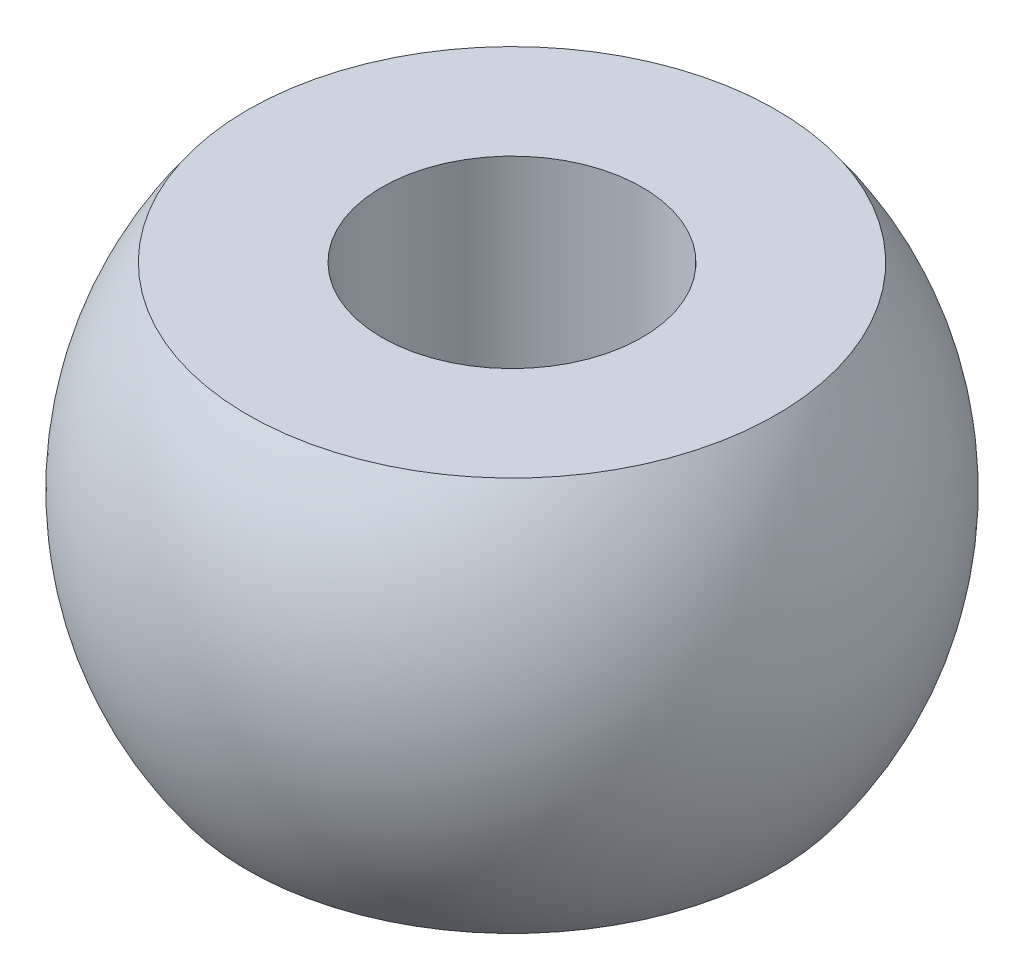
ISO-10303-21;
HEADER;
FILE_DESCRIPTION(('STEP AP214'),'2;1');
FILE_NAME('part.step','',(''),(''),'','','');
FILE_SCHEMA(('AUTOMOTIVE_DESIGN { 1 0 10303 214 1 1 1 1 }'));
ENDSEC;
DATA;
#1=APPLICATION_CONTEXT('core data for automotive mechanical design processes');
#2=APPLICATION_PROTOCOL_DEFINITION('international standard','automotive_design',2000,#1);
#3=PRODUCT_CONTEXT('',#1,'mechanical');
#4=PRODUCT('Part','Part','',(#3));
#5=PRODUCT_RELATED_PRODUCT_CATEGORY('part','',(#4));
#6=PRODUCT_DEFINITION_FORMATION('','',#4);
#7=PRODUCT_DEFINITION_CONTEXT('part definition',#1,'design');
#8=PRODUCT_DEFINITION('design','',#6,#7);
#9=PRODUCT_DEFINITION_SHAPE('','',#8);
#10=(LENGTH_UNIT() NAMED_UNIT(*) SI_UNIT(.MILLI.,.METRE.));
#11=(NAMED_UNIT(*) PLANE_ANGLE_UNIT() SI_UNIT($,.RADIAN.));
#12=(NAMED_UNIT(*) SI_UNIT($,.STERADIAN.) SOLID_ANGLE_UNIT());
#13=UNCERTAINTY_MEASURE_WITH_UNIT(LENGTH_MEASURE(1.E-05),#10,'distance_accuracy_value','');
#14=(GEOMETRIC_REPRESENTATION_CONTEXT(3) GLOBAL_UNCERTAINTY_ASSIGNED_CONTEXT((#13)) GLOBAL_UNIT_ASSIGNED_CONTEXT((#10,
#11,#12)) REPRESENTATION_CONTEXT('',''));
#15=CARTESIAN_POINT('',(0.,0.,0.));
#16=DIRECTION('',(0.,0.,1.));
#17=DIRECTION('',(1.,0.,0.));
#18=AXIS2_PLACEMENT_3D('',#15,#16,#17);
#19=CARTESIAN_POINT('',(-26.5,0.,0.));
#20=DIRECTION('',(0.,1.,0.));
#21=DIRECTION('',(-1.,0.,0.));
#22=AXIS2_PLACEMENT_3D('',#19,#20,#21);
#23=SPHERICAL_SURFACE('',#22,4.18001196170537);
#24=CARTESIAN_POINT('',(-26.5,-2.5,0.));
#25=DIRECTION('',(0.,1.,0.));
#26=DIRECTION('',(0.,0.,1.));
#27=AXIS2_PLACEMENT_3D('',#24,#25,#26);
#28=CIRCLE('',#27,3.35);
#29=CARTESIAN_POINT('',(-29.85,-2.5,0.));
#30=VERTEX_POINT('',#29);
#31=EDGE_CURVE('E46',#30,#30,#28,.T.);
#32=CARTESIAN_POINT('',(-26.5,2.5,0.));
#33=DIRECTION('',(0.,-1.,0.));
#34=DIRECTION('',(0.,0.,-1.));
#35=AXIS2_PLACEMENT_3D('',#32,#33,#34);
#36=CIRCLE('',#35,3.35);
#37=CARTESIAN_POINT('',(-29.85,2.5,0.));
#38=VERTEX_POINT('',#37);
#39=EDGE_CURVE('E10',#38,#38,#36,.T.);
#40=CARTESIAN_POINT('',(-29.85,-2.5,0.));
#41=CARTESIAN_POINT('',(-29.8833916131335,-2.45525631585243,0.));
#42=CARTESIAN_POINT('',(-29.9158857537159,-2.40984293190353,0.));
#43=CARTESIAN_POINT('',(-29.9790292614781,-2.31775126951157,0.));
#44=CARTESIAN_POINT('',(-30.0096786286579,-2.2710729910685,0.));
#45=CARTESIAN_POINT('',(-30.069082761315,-2.17652604479667,0.));
#46=CARTESIAN_POINT('',(-30.0978375267922,-2.12865737696791,0.));
#47=CARTESIAN_POINT('',(-30.1534064627375,-2.03180661209728,0.));
#48=CARTESIAN_POINT('',(-30.1802206332056,-1.98282451505541,0.));
#49=CARTESIAN_POINT('',(-30.2318652885046,-1.88382549356777,0.));
#50=CARTESIAN_POINT('',(-30.2566957733354,-1.833808569122,0.));
#51=CARTESIAN_POINT('',(-30.3043332081818,-1.73282019494329,0.));
#52=CARTESIAN_POINT('',(-30.3271401581974,-1.68184874521034,0.));
#53=CARTESIAN_POINT('',(-30.3706939074187,-1.57903314443856,0.));
#54=CARTESIAN_POINT('',(-30.3914407066244,-1.52718899339971,0.));
#55=CARTESIAN_POINT('',(-30.4308408495514,-1.42271121777903,0.));
#56=CARTESIAN_POINT('',(-30.4494941932727,-1.37007759319718,0.));
#57=CARTESIAN_POINT('',(-30.4846774801553,-1.26410536487046,0.));
#58=CARTESIAN_POINT('',(-30.5012074233166,-1.21076676112559,0.));
#59=CARTESIAN_POINT('',(-30.5321173730641,-1.10347020078109,0.));
#60=CARTESIAN_POINT('',(-30.5464973796504,-1.04951224418145,0.));
#61=CARTESIAN_POINT('',(-30.5730843715199,-0.941063598649812,0.));
#62=CARTESIAN_POINT('',(-30.5852913568032,-0.886572909717807,0.));
#63=CARTESIAN_POINT('',(-30.6075127097847,-0.777146275271525,0.));
#64=CARTESIAN_POINT('',(-30.6175270774829,-0.722210329757249,0.));
#65=CARTESIAN_POINT('',(-30.6353471188897,-0.611981372678108,0.));
#66=CARTESIAN_POINT('',(-30.6431527925983,-0.556688361113244,0.));
#67=CARTESIAN_POINT('',(-30.6565429153139,-0.445834035675866,0.));
#68=CARTESIAN_POINT('',(-30.662127364321,-0.390272721803352,0.));
#69=CARTESIAN_POINT('',(-30.6710660727286,-0.278970986208106,0.));
#70=CARTESIAN_POINT('',(-30.6744203321291,-0.223230564485375,0.));
#71=CARTESIAN_POINT('',(-30.6788932766175,-0.111660095175095,0.));
#72=CARTESIAN_POINT('',(-30.6800119617054,-0.0558300475875474,0.));
#73=CARTESIAN_POINT('',(-30.6800119617054,0.0558300475875482,0.));
#74=CARTESIAN_POINT('',(-30.6788932766175,0.111660095175096,0.));
#75=CARTESIAN_POINT('',(-30.6744203321291,0.223230564485375,0.));
#76=CARTESIAN_POINT('',(-30.6710660727286,0.278970986208107,0.));
#77=CARTESIAN_POINT('',(-30.662127364321,0.390272721803353,0.));
#78=CARTESIAN_POINT('',(-30.6565429153139,0.445834035675867,0.));
#79=CARTESIAN_POINT('',(-30.6431527925983,0.556688361113245,0.));
#80=CARTESIAN_POINT('',(-30.6353471188897,0.611981372678109,0.));
#81=CARTESIAN_POINT('',(-30.6175270774829,0.722210329757249,0.));
#82=CARTESIAN_POINT('',(-30.6075127097847,0.777146275271526,0.));
#83=CARTESIAN_POINT('',(-30.5852913568032,0.886572909717808,0.));
#84=CARTESIAN_POINT('',(-30.5730843715199,0.941063598649813,0.));
#85=CARTESIAN_POINT('',(-30.5464973796504,1.04951224418145,0.));
#86=CARTESIAN_POINT('',(-30.5321173730641,1.10347020078109,0.));
#87=CARTESIAN_POINT('',(-30.5012074233166,1.2107667611256,0.));
#88=CARTESIAN_POINT('',(-30.4846774801553,1.26410536487046,0.));
#89=CARTESIAN_POINT('',(-30.4494941932727,1.37007759319718,0.));
#90=CARTESIAN_POINT('',(-30.4308408495514,1.42271121777903,0.));
#91=CARTESIAN_POINT('',(-30.3914407066244,1.52718899339972,0.));
#92=CARTESIAN_POINT('',(-30.3706939074187,1.57903314443856,0.));
#93=CARTESIAN_POINT('',(-30.3271401581974,1.68184874521035,0.));
#94=CARTESIAN_POINT('',(-30.3043332081818,1.73282019494329,0.));
#95=CARTESIAN_POINT('',(-30.2566957733354,1.833808569122,0.));
#96=CARTESIAN_POINT('',(-30.2318652885046,1.88382549356777,0.));
#97=CARTESIAN_POINT('',(-30.1802206332056,1.98282451505541,0.));
#98=CARTESIAN_POINT('',(-30.1534064627375,2.03180661209728,0.));
#99=CARTESIAN_POINT('',(-30.0978375267922,2.12865737696792,0.));
#100=CARTESIAN_POINT('',(-30.069082761315,2.17652604479667,0.));
#101=CARTESIAN_POINT('',(-30.0096786286579,2.2710729910685,0.));
#102=CARTESIAN_POINT('',(-29.9790292614781,2.31775126951157,0.));
#103=CARTESIAN_POINT('',(-29.9158857537159,2.40984293190353,0.));
#104=CARTESIAN_POINT('',(-29.8833916131335,2.45525631585243,0.));
#105=CARTESIAN_POINT('',(-29.85,2.5,0.));
#106=B_SPLINE_CURVE_WITH_KNOTS('',3,(#40,#41,#42,#43,#44,#45,#46,#47,#48,#49,#50,#51,#52,#53,
#54,#55,#56,#57,#58,#59,#60,#61,#62,#63,#64,#65,#66,#67,#68,#69,#70,#71,#72,#73,#74,#75,#76,#77,
#78,#79,#80,#81,#82,#83,#84,#85,#86,#87,#88,#89,#90,#91,#92,#93,#94,#95,#96,#97,#98,#99,#100,
#101,#102,#103,#104,#105),.UNSPECIFIED.,.F.,.F.,(4,2,2,2,2,2,2,2,2,2,2,2,2,2,2,2,2,2,2,2,2,2,2,
2,2,2,2,2,2,2,2,2,4),(0.,0.167478940654279,0.334957881308556,0.502436821962833,
0.669915762617111,0.837394703271388,1.00487364392567,1.17235258457994,1.33983152523422,
1.5073104658885,1.67478940654278,1.84226834719706,2.00974728785133,2.17722622850561,
2.34470516915989,2.51218410981417,2.67966305046844,2.84714199112272,3.014620931777,
3.18209987243128,3.34957881308555,3.51705775373983,3.68453669439411,3.85201563504839,
4.01949457570266,4.18697351635694,4.35445245701122,4.5219313976655,4.68941033831978,
4.85688927897405,5.02436821962833,5.19184716028261,5.35932610093689),.UNSPECIFIED.);
#107=EDGE_CURVE('BSEAM39',#30,#38,#106,.T.);
#108=ORIENTED_EDGE('',*,*,#31,.T.);
#109=ORIENTED_EDGE('',*,*,#39,.T.);
#110=ORIENTED_EDGE('',*,*,#107,.T.);
#111=ORIENTED_EDGE('',*,*,#107,.F.);
#112=EDGE_LOOP('',(#108,#110,#109,#111));
#113=FACE_BOUND('',#112,.T.);
#114=ADVANCED_FACE('F39',(#113),#23,.T.);
#115=CARTESIAN_POINT('',(-32.5,-2.5,5.));
#116=DIRECTION('',(0.,1.,0.));
#117=DIRECTION('',(0.,0.,1.));
#118=AXIS2_PLACEMENT_3D('',#115,#116,#117);
#119=PLANE('',#118);
#120=CARTESIAN_POINT('',(-26.5,-2.5,0.));
#121=DIRECTION('',(0.,1.,0.));
#122=DIRECTION('',(0.,0.,1.));
#123=AXIS2_PLACEMENT_3D('',#120,#121,#122);
#124=CIRCLE('',#123,1.65);
#125=CARTESIAN_POINT('',(-26.5,-2.5,1.65));
#126=VERTEX_POINT('',#125);
#127=EDGE_CURVE('E50',#126,#126,#124,.T.);
#128=ORIENTED_EDGE('',*,*,#127,.T.);
#129=EDGE_LOOP('',(#128));
#130=FACE_BOUND('',#129,.T.);
#131=ORIENTED_EDGE('',*,*,#31,.F.);
#132=EDGE_LOOP('',(#131));
#133=FACE_BOUND('',#132,.T.);
#134=ADVANCED_FACE('F64',(#130,#133),#119,.F.);
#135=CARTESIAN_POINT('',(-32.5,2.5,5.));
#136=DIRECTION('',(0.,-1.,0.));
#137=DIRECTION('',(0.,0.,-1.));
#138=AXIS2_PLACEMENT_3D('',#135,#136,#137);
#139=PLANE('',#138);
#140=CARTESIAN_POINT('',(-26.5,2.5,0.));
#141=DIRECTION('',(0.,1.,0.));
#142=DIRECTION('',(0.,0.,1.));
#143=AXIS2_PLACEMENT_3D('',#140,#141,#142);
#144=CIRCLE('',#143,1.65);
#145=CARTESIAN_POINT('',(-26.5,2.5,1.65));
#146=VERTEX_POINT('',#145);
#147=EDGE_CURVE('E54',#146,#146,#144,.T.);
#148=ORIENTED_EDGE('',*,*,#147,.F.);
#149=EDGE_LOOP('',(#148));
#150=FACE_BOUND('',#149,.T.);
#151=ORIENTED_EDGE('',*,*,#39,.F.);
#152=EDGE_LOOP('',(#151));
#153=FACE_BOUND('',#152,.T.);
#154=ADVANCED_FACE('F41',(#150,#153),#139,.F.);
#155=CARTESIAN_POINT('',(-26.5,-2.5,0.));
#156=DIRECTION('',(0.,1.,0.));
#157=DIRECTION('',(0.,0.,1.));
#158=AXIS2_PLACEMENT_3D('',#155,#156,#157);
#159=CYLINDRICAL_SURFACE('',#158,1.65);
#160=ORIENTED_EDGE('',*,*,#127,.F.);
#161=EDGE_LOOP('',(#160));
#162=FACE_BOUND('',#161,.T.);
#163=ORIENTED_EDGE('',*,*,#147,.T.);
#164=EDGE_LOOP('',(#163));
#165=FACE_BOUND('',#164,.T.);
#166=ADVANCED_FACE('F60',(#162,#165),#159,.F.);
#167=CLOSED_SHELL('',(#114,#134,#154,#166));
#168=MANIFOLD_SOLID_BREP('B2',#167);
#169=ADVANCED_BREP_SHAPE_REPRESENTATION('',(#18,#168),#14);
#170=SHAPE_DEFINITION_REPRESENTATION(#9,#169);
ENDSEC;
END-ISO-10303-21;
